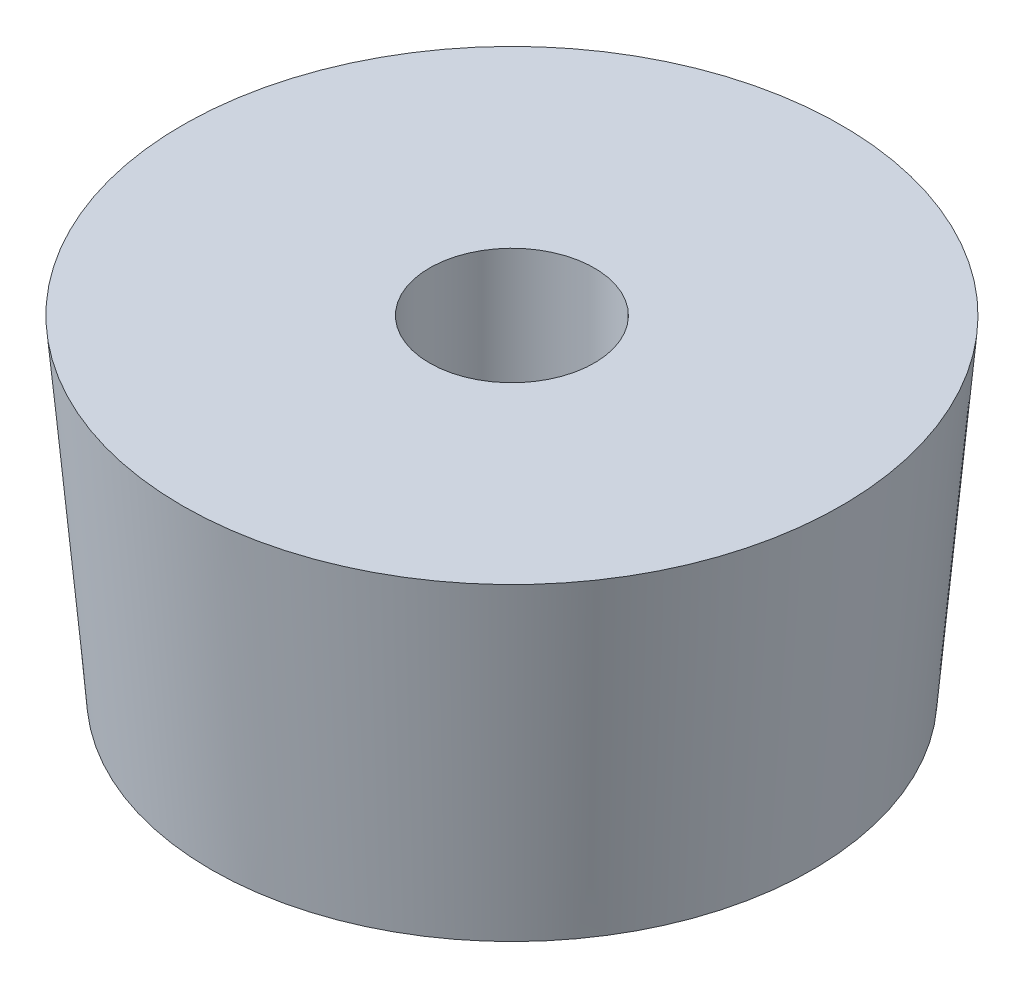
ISO-10303-21;
HEADER;
FILE_DESCRIPTION(('STEP AP214'),'2;1');
FILE_NAME('part.step','',(''),(''),'','','');
FILE_SCHEMA(('AUTOMOTIVE_DESIGN { 1 0 10303 214 1 1 1 1 }'));
ENDSEC;
DATA;
#1=APPLICATION_CONTEXT('core data for automotive mechanical design processes');
#2=APPLICATION_PROTOCOL_DEFINITION('international standard','automotive_design',2000,#1);
#3=PRODUCT_CONTEXT('',#1,'mechanical');
#4=PRODUCT('Part','Part','',(#3));
#5=PRODUCT_RELATED_PRODUCT_CATEGORY('part','',(#4));
#6=PRODUCT_DEFINITION_FORMATION('','',#4);
#7=PRODUCT_DEFINITION_CONTEXT('part definition',#1,'design');
#8=PRODUCT_DEFINITION('design','',#6,#7);
#9=PRODUCT_DEFINITION_SHAPE('','',#8);
#10=(LENGTH_UNIT() NAMED_UNIT(*) SI_UNIT(.MILLI.,.METRE.));
#11=(NAMED_UNIT(*) PLANE_ANGLE_UNIT() SI_UNIT($,.RADIAN.));
#12=(NAMED_UNIT(*) SI_UNIT($,.STERADIAN.) SOLID_ANGLE_UNIT());
#13=UNCERTAINTY_MEASURE_WITH_UNIT(LENGTH_MEASURE(1.E-05),#10,'distance_accuracy_value','');
#14=(GEOMETRIC_REPRESENTATION_CONTEXT(3) GLOBAL_UNCERTAINTY_ASSIGNED_CONTEXT((#13)) GLOBAL_UNIT_ASSIGNED_CONTEXT((#10,
#11,#12)) REPRESENTATION_CONTEXT('',''));
#15=CARTESIAN_POINT('',(0.,0.,0.));
#16=DIRECTION('',(0.,0.,1.));
#17=DIRECTION('',(1.,0.,0.));
#18=AXIS2_PLACEMENT_3D('',#15,#16,#17);
#19=CARTESIAN_POINT('',(0.,0.,0.));
#20=DIRECTION('',(0.,1.,0.));
#21=DIRECTION('',(0.,0.,1.));
#22=AXIS2_PLACEMENT_3D('',#19,#20,#21);
#23=CONICAL_SURFACE('',#22,12.7,0.0872664625997167);
#24=CARTESIAN_POINT('',(0.,-12.7,0.));
#25=DIRECTION('',(0.,1.,0.));
#26=DIRECTION('',(0.,0.,1.));
#27=AXIS2_PLACEMENT_3D('',#24,#25,#26);
#28=CIRCLE('',#27,11.5888939732208);
#29=CARTESIAN_POINT('',(0.,-12.7,11.5888939732208));
#30=VERTEX_POINT('',#29);
#31=EDGE_CURVE('E10',#30,#30,#28,.T.);
#32=ORIENTED_EDGE('',*,*,#31,.T.);
#33=EDGE_LOOP('',(#32));
#34=FACE_BOUND('',#33,.T.);
#35=CARTESIAN_POINT('',(0.,0.,0.));
#36=DIRECTION('',(0.,1.,0.));
#37=DIRECTION('',(0.,0.,1.));
#38=AXIS2_PLACEMENT_3D('',#35,#36,#37);
#39=CIRCLE('',#38,12.7);
#40=CARTESIAN_POINT('',(0.,0.,12.7));
#41=VERTEX_POINT('',#40);
#42=EDGE_CURVE('E39',#41,#41,#39,.T.);
#43=ORIENTED_EDGE('',*,*,#42,.F.);
#44=EDGE_LOOP('',(#43));
#45=FACE_BOUND('',#44,.T.);
#46=ADVANCED_FACE('F33',(#34,#45),#23,.T.);
#47=CARTESIAN_POINT('',(0.,-12.7,0.));
#48=DIRECTION('',(0.,1.,0.));
#49=DIRECTION('',(0.,0.,1.));
#50=AXIS2_PLACEMENT_3D('',#47,#48,#49);
#51=PLANE('',#50);
#52=CARTESIAN_POINT('',(-8.636,-12.7,0.));
#53=DIRECTION('',(0.,-1.,0.));
#54=DIRECTION('',(0.,0.,-1.));
#55=AXIS2_PLACEMENT_3D('',#52,#53,#54);
#56=CIRCLE('',#55,1.27);
#57=CARTESIAN_POINT('',(-8.636,-12.7,-1.27));
#58=VERTEX_POINT('',#57);
#59=EDGE_CURVE('E56',#58,#58,#56,.T.);
#60=ORIENTED_EDGE('',*,*,#59,.F.);
#61=EDGE_LOOP('',(#60));
#62=FACE_BOUND('',#61,.T.);
#63=CARTESIAN_POINT('',(4.31800000000004,-12.7,7.47899538708239));
#64=DIRECTION('',(0.,-1.,0.));
#65=DIRECTION('',(0.,0.,-1.));
#66=AXIS2_PLACEMENT_3D('',#63,#64,#65);
#67=CIRCLE('',#66,1.27);
#68=CARTESIAN_POINT('',(4.31800000000004,-12.7,6.20899538708239));
#69=VERTEX_POINT('',#68);
#70=EDGE_CURVE('E53',#69,#69,#67,.T.);
#71=ORIENTED_EDGE('',*,*,#70,.F.);
#72=EDGE_LOOP('',(#71));
#73=FACE_BOUND('',#72,.T.);
#74=CARTESIAN_POINT('',(0.,-12.7,0.));
#75=DIRECTION('',(0.,1.,0.));
#76=DIRECTION('',(0.,0.,1.));
#77=AXIS2_PLACEMENT_3D('',#74,#75,#76);
#78=CIRCLE('',#77,3.175);
#79=CARTESIAN_POINT('',(0.,-12.7,3.175));
#80=VERTEX_POINT('',#79);
#81=EDGE_CURVE('E43',#80,#80,#78,.T.);
#82=ORIENTED_EDGE('',*,*,#81,.T.);
#83=EDGE_LOOP('',(#82));
#84=FACE_BOUND('',#83,.T.);
#85=ORIENTED_EDGE('',*,*,#31,.F.);
#86=EDGE_LOOP('',(#85));
#87=FACE_BOUND('',#86,.T.);
#88=ADVANCED_FACE('F67',(#62,#73,#84,#87),#51,.F.);
#89=CARTESIAN_POINT('',(0.,0.,0.));
#90=DIRECTION('',(0.,1.,0.));
#91=DIRECTION('',(0.,0.,1.));
#92=AXIS2_PLACEMENT_3D('',#89,#90,#91);
#93=PLANE('',#92);
#94=CARTESIAN_POINT('',(0.,0.,0.));
#95=DIRECTION('',(0.,1.,0.));
#96=DIRECTION('',(0.,0.,1.));
#97=AXIS2_PLACEMENT_3D('',#94,#95,#96);
#98=CIRCLE('',#97,3.175);
#99=CARTESIAN_POINT('',(0.,0.,3.175));
#100=VERTEX_POINT('',#99);
#101=EDGE_CURVE('E47',#100,#100,#98,.T.);
#102=ORIENTED_EDGE('',*,*,#101,.F.);
#103=EDGE_LOOP('',(#102));
#104=FACE_BOUND('',#103,.T.);
#105=ORIENTED_EDGE('',*,*,#42,.T.);
#106=EDGE_LOOP('',(#105));
#107=FACE_BOUND('',#106,.T.);
#108=ADVANCED_FACE('F70',(#104,#107),#93,.T.);
#109=CARTESIAN_POINT('',(0.,-12.7,0.));
#110=DIRECTION('',(0.,1.,0.));
#111=DIRECTION('',(0.,0.,1.));
#112=AXIS2_PLACEMENT_3D('',#109,#110,#111);
#113=CYLINDRICAL_SURFACE('',#112,3.175);
#114=ORIENTED_EDGE('',*,*,#81,.F.);
#115=EDGE_LOOP('',(#114));
#116=FACE_BOUND('',#115,.T.);
#117=ORIENTED_EDGE('',*,*,#101,.T.);
#118=EDGE_LOOP('',(#117));
#119=FACE_BOUND('',#118,.T.);
#120=ADVANCED_FACE('F77',(#116,#119),#113,.F.);
#121=CARTESIAN_POINT('',(4.31800000000004,-5.08,7.47899538708239));
#122=DIRECTION('',(0.,-1.,0.));
#123=DIRECTION('',(0.,0.,-1.));
#124=AXIS2_PLACEMENT_3D('',#121,#122,#123);
#125=CYLINDRICAL_SURFACE('',#124,1.27);
#126=CARTESIAN_POINT('',(4.31800000000004,-5.08,7.47899538708239));
#127=DIRECTION('',(0.,-1.,0.));
#128=DIRECTION('',(0.,0.,-1.));
#129=AXIS2_PLACEMENT_3D('',#126,#127,#128);
#130=CIRCLE('',#129,1.27);
#131=CARTESIAN_POINT('',(4.31800000000004,-5.08,6.20899538708239));
#132=VERTEX_POINT('',#131);
#133=EDGE_CURVE('E51',#132,#132,#130,.T.);
#134=CARTESIAN_POINT('',(4.31800000000004,-5.08,6.20899538708239));
#135=CARTESIAN_POINT('',(4.31800000000004,-5.159375,6.20899538708239));
#136=CARTESIAN_POINT('',(4.31800000000004,-5.23875,6.20899538708239));
#137=CARTESIAN_POINT('',(4.31800000000004,-5.3975,6.20899538708239));
#138=CARTESIAN_POINT('',(4.31800000000004,-5.476875,6.20899538708239));
#139=CARTESIAN_POINT('',(4.31800000000004,-5.635625,6.20899538708239));
#140=CARTESIAN_POINT('',(4.31800000000004,-5.715,6.20899538708239));
#141=CARTESIAN_POINT('',(4.31800000000004,-5.87375,6.20899538708239));
#142=CARTESIAN_POINT('',(4.31800000000004,-5.953125,6.20899538708239));
#143=CARTESIAN_POINT('',(4.31800000000004,-6.111875,6.20899538708239));
#144=CARTESIAN_POINT('',(4.31800000000004,-6.19125,6.20899538708239));
#145=CARTESIAN_POINT('',(4.31800000000004,-6.35,6.20899538708239));
#146=CARTESIAN_POINT('',(4.31800000000004,-6.429375,6.20899538708239));
#147=CARTESIAN_POINT('',(4.31800000000004,-6.588125,6.20899538708239));
#148=CARTESIAN_POINT('',(4.31800000000004,-6.6675,6.20899538708239));
#149=CARTESIAN_POINT('',(4.31800000000004,-6.82625,6.20899538708239));
#150=CARTESIAN_POINT('',(4.31800000000004,-6.905625,6.20899538708239));
#151=CARTESIAN_POINT('',(4.31800000000004,-7.064375,6.20899538708239));
#152=CARTESIAN_POINT('',(4.31800000000004,-7.14375,6.20899538708239));
#153=CARTESIAN_POINT('',(4.31800000000004,-7.3025,6.20899538708239));
#154=CARTESIAN_POINT('',(4.31800000000004,-7.381875,6.20899538708239));
#155=CARTESIAN_POINT('',(4.31800000000004,-7.540625,6.20899538708239));
#156=CARTESIAN_POINT('',(4.31800000000004,-7.62,6.20899538708239));
#157=CARTESIAN_POINT('',(4.31800000000004,-7.77875,6.20899538708239));
#158=CARTESIAN_POINT('',(4.31800000000004,-7.858125,6.20899538708239));
#159=CARTESIAN_POINT('',(4.31800000000004,-8.016875,6.20899538708239));
#160=CARTESIAN_POINT('',(4.31800000000004,-8.09625,6.20899538708239));
#161=CARTESIAN_POINT('',(4.31800000000004,-8.255,6.20899538708239));
#162=CARTESIAN_POINT('',(4.31800000000004,-8.334375,6.20899538708239));
#163=CARTESIAN_POINT('',(4.31800000000004,-8.493125,6.20899538708239));
#164=CARTESIAN_POINT('',(4.31800000000004,-8.5725,6.20899538708239));
#165=CARTESIAN_POINT('',(4.31800000000004,-8.73125,6.20899538708239));
#166=CARTESIAN_POINT('',(4.31800000000004,-8.810625,6.20899538708239));
#167=CARTESIAN_POINT('',(4.31800000000004,-8.969375,6.20899538708239));
#168=CARTESIAN_POINT('',(4.31800000000004,-9.04875,6.20899538708239));
#169=CARTESIAN_POINT('',(4.31800000000004,-9.2075,6.20899538708239));
#170=CARTESIAN_POINT('',(4.31800000000004,-9.286875,6.20899538708239));
#171=CARTESIAN_POINT('',(4.31800000000004,-9.445625,6.20899538708239));
#172=CARTESIAN_POINT('',(4.31800000000004,-9.525,6.20899538708239));
#173=CARTESIAN_POINT('',(4.31800000000004,-9.68375,6.20899538708239));
#174=CARTESIAN_POINT('',(4.31800000000004,-9.763125,6.20899538708239));
#175=CARTESIAN_POINT('',(4.31800000000004,-9.921875,6.20899538708239));
#176=CARTESIAN_POINT('',(4.31800000000004,-10.00125,6.20899538708239));
#177=CARTESIAN_POINT('',(4.31800000000004,-10.16,6.20899538708239));
#178=CARTESIAN_POINT('',(4.31800000000004,-10.239375,6.20899538708239));
#179=CARTESIAN_POINT('',(4.31800000000004,-10.398125,6.20899538708239));
#180=CARTESIAN_POINT('',(4.31800000000004,-10.4775,6.20899538708239));
#181=CARTESIAN_POINT('',(4.31800000000004,-10.63625,6.20899538708239));
#182=CARTESIAN_POINT('',(4.31800000000004,-10.715625,6.20899538708239));
#183=CARTESIAN_POINT('',(4.31800000000004,-10.874375,6.20899538708239));
#184=CARTESIAN_POINT('',(4.31800000000004,-10.95375,6.20899538708239));
#185=CARTESIAN_POINT('',(4.31800000000004,-11.1125,6.20899538708239));
#186=CARTESIAN_POINT('',(4.31800000000004,-11.191875,6.20899538708239));
#187=CARTESIAN_POINT('',(4.31800000000004,-11.350625,6.20899538708239));
#188=CARTESIAN_POINT('',(4.31800000000004,-11.43,6.20899538708239));
#189=CARTESIAN_POINT('',(4.31800000000004,-11.58875,6.20899538708239));
#190=CARTESIAN_POINT('',(4.31800000000004,-11.668125,6.20899538708239));
#191=CARTESIAN_POINT('',(4.31800000000004,-11.826875,6.20899538708239));
#192=CARTESIAN_POINT('',(4.31800000000004,-11.90625,6.20899538708239));
#193=CARTESIAN_POINT('',(4.31800000000004,-12.065,6.20899538708239));
#194=CARTESIAN_POINT('',(4.31800000000004,-12.144375,6.20899538708239));
#195=CARTESIAN_POINT('',(4.31800000000004,-12.303125,6.20899538708239));
#196=CARTESIAN_POINT('',(4.31800000000004,-12.3825,6.20899538708239));
#197=CARTESIAN_POINT('',(4.31800000000004,-12.54125,6.20899538708239));
#198=CARTESIAN_POINT('',(4.31800000000004,-12.620625,6.20899538708239));
#199=CARTESIAN_POINT('',(4.31800000000004,-12.7,6.20899538708239));
#200=B_SPLINE_CURVE_WITH_KNOTS('',3,(#134,#135,#136,#137,#138,#139,#140,#141,#142,#143,#144,
#145,#146,#147,#148,#149,#150,#151,#152,#153,#154,#155,#156,#157,#158,#159,#160,#161,#162,#163,
#164,#165,#166,#167,#168,#169,#170,#171,#172,#173,#174,#175,#176,#177,#178,#179,#180,#181,#182,
#183,#184,#185,#186,#187,#188,#189,#190,#191,#192,#193,#194,#195,#196,#197,#198,#199),
.UNSPECIFIED.,.F.,.F.,(4,2,2,2,2,2,2,2,2,2,2,2,2,2,2,2,2,2,2,2,2,2,2,2,2,2,2,2,2,2,2,2,4),(0.,
0.238125,0.47625,0.714375000000001,0.9525,1.190625,1.42875,1.666875,1.905,2.143125,2.38125,
2.619375,2.8575,3.095625,3.33375,3.571875,3.81,4.048125,4.28625,4.524375,4.7625,5.000625,
5.23875,5.476875,5.715,5.953125,6.19125,6.429375,6.6675,6.905625,7.14375,7.381875,7.62),.UNSPECIFIED.);
#201=EDGE_CURVE('BSEAM80',#132,#69,#200,.T.);
#202=ORIENTED_EDGE('',*,*,#133,.F.);
#203=ORIENTED_EDGE('',*,*,#70,.T.);
#204=ORIENTED_EDGE('',*,*,#201,.T.);
#205=ORIENTED_EDGE('',*,*,#201,.F.);
#206=EDGE_LOOP('',(#202,#204,#203,#205));
#207=FACE_BOUND('',#206,.T.);
#208=ADVANCED_FACE('F80',(#207),#125,.F.);
#209=CARTESIAN_POINT('',(4.31800000000004,-5.08,7.47899538708239));
#210=DIRECTION('',(0.,-1.,0.));
#211=DIRECTION('',(0.,0.,-1.));
#212=AXIS2_PLACEMENT_3D('',#209,#210,#211);
#213=PLANE('',#212);
#214=ORIENTED_EDGE('',*,*,#133,.T.);
#215=EDGE_LOOP('',(#214));
#216=FACE_BOUND('',#215,.T.);
#217=ADVANCED_FACE('F108',(#216),#213,.T.);
#218=CARTESIAN_POINT('',(-8.636,-5.08,0.));
#219=DIRECTION('',(0.,-1.,0.));
#220=DIRECTION('',(0.,0.,-1.));
#221=AXIS2_PLACEMENT_3D('',#218,#219,#220);
#222=CYLINDRICAL_SURFACE('',#221,1.27);
#223=CARTESIAN_POINT('',(-8.636,-5.08,0.));
#224=DIRECTION('',(0.,-1.,0.));
#225=DIRECTION('',(0.,0.,-1.));
#226=AXIS2_PLACEMENT_3D('',#223,#224,#225);
#227=CIRCLE('',#226,1.27);
#228=CARTESIAN_POINT('',(-8.636,-5.08,-1.27));
#229=VERTEX_POINT('',#228);
#230=EDGE_CURVE('E59',#229,#229,#227,.T.);
#231=CARTESIAN_POINT('',(-8.636,-5.08,-1.27));
#232=CARTESIAN_POINT('',(-8.636,-5.159375,-1.27));
#233=CARTESIAN_POINT('',(-8.636,-5.23875,-1.27));
#234=CARTESIAN_POINT('',(-8.636,-5.3975,-1.27));
#235=CARTESIAN_POINT('',(-8.636,-5.476875,-1.27));
#236=CARTESIAN_POINT('',(-8.636,-5.635625,-1.27));
#237=CARTESIAN_POINT('',(-8.636,-5.715,-1.27));
#238=CARTESIAN_POINT('',(-8.636,-5.87375,-1.27));
#239=CARTESIAN_POINT('',(-8.636,-5.953125,-1.27));
#240=CARTESIAN_POINT('',(-8.636,-6.111875,-1.27));
#241=CARTESIAN_POINT('',(-8.636,-6.19125,-1.27));
#242=CARTESIAN_POINT('',(-8.636,-6.35,-1.27));
#243=CARTESIAN_POINT('',(-8.636,-6.429375,-1.27));
#244=CARTESIAN_POINT('',(-8.636,-6.588125,-1.27));
#245=CARTESIAN_POINT('',(-8.636,-6.6675,-1.27));
#246=CARTESIAN_POINT('',(-8.636,-6.82625,-1.27));
#247=CARTESIAN_POINT('',(-8.636,-6.905625,-1.27));
#248=CARTESIAN_POINT('',(-8.636,-7.064375,-1.27));
#249=CARTESIAN_POINT('',(-8.636,-7.14375,-1.27));
#250=CARTESIAN_POINT('',(-8.636,-7.3025,-1.27));
#251=CARTESIAN_POINT('',(-8.636,-7.381875,-1.27));
#252=CARTESIAN_POINT('',(-8.636,-7.540625,-1.27));
#253=CARTESIAN_POINT('',(-8.636,-7.62,-1.27));
#254=CARTESIAN_POINT('',(-8.636,-7.77875,-1.27));
#255=CARTESIAN_POINT('',(-8.636,-7.858125,-1.27));
#256=CARTESIAN_POINT('',(-8.636,-8.016875,-1.27));
#257=CARTESIAN_POINT('',(-8.636,-8.09625,-1.27));
#258=CARTESIAN_POINT('',(-8.636,-8.255,-1.27));
#259=CARTESIAN_POINT('',(-8.636,-8.334375,-1.27));
#260=CARTESIAN_POINT('',(-8.636,-8.493125,-1.27));
#261=CARTESIAN_POINT('',(-8.636,-8.5725,-1.27));
#262=CARTESIAN_POINT('',(-8.636,-8.73125,-1.27));
#263=CARTESIAN_POINT('',(-8.636,-8.810625,-1.27));
#264=CARTESIAN_POINT('',(-8.636,-8.969375,-1.27));
#265=CARTESIAN_POINT('',(-8.636,-9.04875,-1.27));
#266=CARTESIAN_POINT('',(-8.636,-9.2075,-1.27));
#267=CARTESIAN_POINT('',(-8.636,-9.286875,-1.27));
#268=CARTESIAN_POINT('',(-8.636,-9.445625,-1.27));
#269=CARTESIAN_POINT('',(-8.636,-9.525,-1.27));
#270=CARTESIAN_POINT('',(-8.636,-9.68375,-1.27));
#271=CARTESIAN_POINT('',(-8.636,-9.763125,-1.27));
#272=CARTESIAN_POINT('',(-8.636,-9.921875,-1.27));
#273=CARTESIAN_POINT('',(-8.636,-10.00125,-1.27));
#274=CARTESIAN_POINT('',(-8.636,-10.16,-1.27));
#275=CARTESIAN_POINT('',(-8.636,-10.239375,-1.27));
#276=CARTESIAN_POINT('',(-8.636,-10.398125,-1.27));
#277=CARTESIAN_POINT('',(-8.636,-10.4775,-1.27));
#278=CARTESIAN_POINT('',(-8.636,-10.63625,-1.27));
#279=CARTESIAN_POINT('',(-8.636,-10.715625,-1.27));
#280=CARTESIAN_POINT('',(-8.636,-10.874375,-1.27));
#281=CARTESIAN_POINT('',(-8.636,-10.95375,-1.27));
#282=CARTESIAN_POINT('',(-8.636,-11.1125,-1.27));
#283=CARTESIAN_POINT('',(-8.636,-11.191875,-1.27));
#284=CARTESIAN_POINT('',(-8.636,-11.350625,-1.27));
#285=CARTESIAN_POINT('',(-8.636,-11.43,-1.27));
#286=CARTESIAN_POINT('',(-8.636,-11.58875,-1.27));
#287=CARTESIAN_POINT('',(-8.636,-11.668125,-1.27));
#288=CARTESIAN_POINT('',(-8.636,-11.826875,-1.27));
#289=CARTESIAN_POINT('',(-8.636,-11.90625,-1.27));
#290=CARTESIAN_POINT('',(-8.636,-12.065,-1.27));
#291=CARTESIAN_POINT('',(-8.636,-12.144375,-1.27));
#292=CARTESIAN_POINT('',(-8.636,-12.303125,-1.27));
#293=CARTESIAN_POINT('',(-8.636,-12.3825,-1.27));
#294=CARTESIAN_POINT('',(-8.636,-12.54125,-1.27));
#295=CARTESIAN_POINT('',(-8.636,-12.620625,-1.27));
#296=CARTESIAN_POINT('',(-8.636,-12.7,-1.27));
#297=B_SPLINE_CURVE_WITH_KNOTS('',3,(#231,#232,#233,#234,#235,#236,#237,#238,#239,#240,#241,
#242,#243,#244,#245,#246,#247,#248,#249,#250,#251,#252,#253,#254,#255,#256,#257,#258,#259,#260,
#261,#262,#263,#264,#265,#266,#267,#268,#269,#270,#271,#272,#273,#274,#275,#276,#277,#278,#279,
#280,#281,#282,#283,#284,#285,#286,#287,#288,#289,#290,#291,#292,#293,#294,#295,#296),
.UNSPECIFIED.,.F.,.F.,(4,2,2,2,2,2,2,2,2,2,2,2,2,2,2,2,2,2,2,2,2,2,2,2,2,2,2,2,2,2,2,2,4),(0.,
0.238125,0.47625,0.714375000000001,0.9525,1.190625,1.42875,1.666875,1.905,2.143125,2.38125,
2.619375,2.8575,3.095625,3.33375,3.571875,3.81,4.048125,4.28625,4.524375,4.7625,5.000625,
5.23875,5.476875,5.715,5.953125,6.19125,6.429375,6.6675,6.905625,7.14375,7.381875,7.62),.UNSPECIFIED.);
#298=EDGE_CURVE('BSEAM65',#229,#58,#297,.T.);
#299=ORIENTED_EDGE('',*,*,#230,.F.);
#300=ORIENTED_EDGE('',*,*,#59,.T.);
#301=ORIENTED_EDGE('',*,*,#298,.T.);
#302=ORIENTED_EDGE('',*,*,#298,.F.);
#303=EDGE_LOOP('',(#299,#301,#300,#302));
#304=FACE_BOUND('',#303,.T.);
#305=ADVANCED_FACE('F65',(#304),#222,.F.);
#306=CARTESIAN_POINT('',(-8.636,-5.08,0.));
#307=DIRECTION('',(0.,-1.,0.));
#308=DIRECTION('',(0.,0.,-1.));
#309=AXIS2_PLACEMENT_3D('',#306,#307,#308);
#310=PLANE('',#309);
#311=ORIENTED_EDGE('',*,*,#230,.T.);
#312=EDGE_LOOP('',(#311));
#313=FACE_BOUND('',#312,.T.);
#314=ADVANCED_FACE('F127',(#313),#310,.T.);
#315=CLOSED_SHELL('',(#46,#88,#108,#120,#208,#217,#305,#314));
#316=MANIFOLD_SOLID_BREP('B2',#315);
#317=ADVANCED_BREP_SHAPE_REPRESENTATION('',(#18,#316),#14);
#318=SHAPE_DEFINITION_REPRESENTATION(#9,#317);
ENDSEC;
END-ISO-10303-21;
